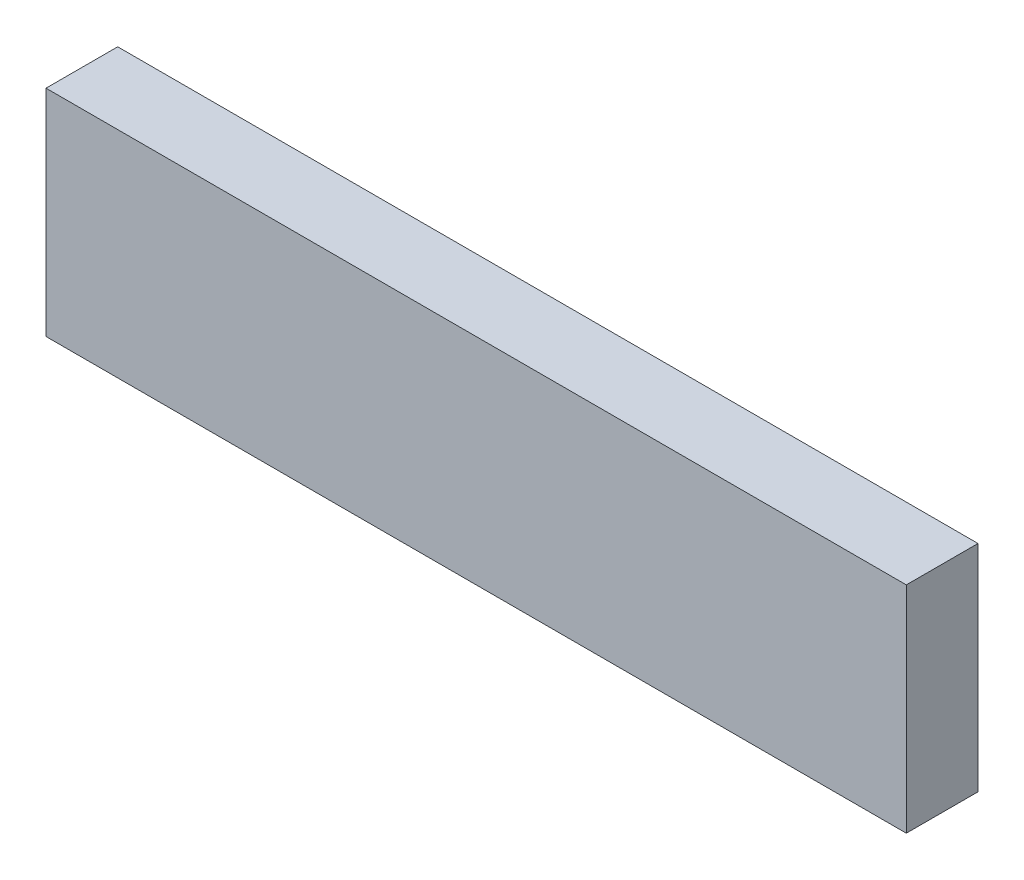
ISO-10303-21;
HEADER;
FILE_DESCRIPTION(('STEP AP214'),'2;1');
FILE_NAME('part.step','',(''),(''),'','','');
FILE_SCHEMA(('AUTOMOTIVE_DESIGN { 1 0 10303 214 1 1 1 1 }'));
ENDSEC;
DATA;
#1=APPLICATION_CONTEXT('core data for automotive mechanical design processes');
#2=APPLICATION_PROTOCOL_DEFINITION('international standard','automotive_design',2000,#1);
#3=PRODUCT_CONTEXT('',#1,'mechanical');
#4=PRODUCT('Part','Part','',(#3));
#5=PRODUCT_RELATED_PRODUCT_CATEGORY('part','',(#4));
#6=PRODUCT_DEFINITION_FORMATION('','',#4);
#7=PRODUCT_DEFINITION_CONTEXT('part definition',#1,'design');
#8=PRODUCT_DEFINITION('design','',#6,#7);
#9=PRODUCT_DEFINITION_SHAPE('','',#8);
#10=(LENGTH_UNIT() NAMED_UNIT(*) SI_UNIT(.MILLI.,.METRE.));
#11=(NAMED_UNIT(*) PLANE_ANGLE_UNIT() SI_UNIT($,.RADIAN.));
#12=(NAMED_UNIT(*) SI_UNIT($,.STERADIAN.) SOLID_ANGLE_UNIT());
#13=UNCERTAINTY_MEASURE_WITH_UNIT(LENGTH_MEASURE(1.E-05),#10,'distance_accuracy_value','');
#14=(GEOMETRIC_REPRESENTATION_CONTEXT(3) GLOBAL_UNCERTAINTY_ASSIGNED_CONTEXT((#13)) GLOBAL_UNIT_ASSIGNED_CONTEXT((#10,
#11,#12)) REPRESENTATION_CONTEXT('',''));
#15=CARTESIAN_POINT('',(0.,0.,0.));
#16=DIRECTION('',(0.,0.,1.));
#17=DIRECTION('',(1.,0.,0.));
#18=AXIS2_PLACEMENT_3D('',#15,#16,#17);
#19=CARTESIAN_POINT('',(-60.,-25.,480.));
#20=DIRECTION('',(0.,0.,1.));
#21=DIRECTION('',(1.,0.,0.));
#22=AXIS2_PLACEMENT_3D('',#19,#20,#21);
#23=PLANE('',#22);
#24=DIRECTION('',(0.,1.,0.));
#25=VECTOR('',#24,1.);
#26=CARTESIAN_POINT('',(-60.,-25.,480.));
#27=LINE('',#26,#25);
#28=CARTESIAN_POINT('',(-60.,-25.,480.));
#29=VERTEX_POINT('',#28);
#30=CARTESIAN_POINT('',(-60.,5.,480.));
#31=VERTEX_POINT('',#30);
#32=EDGE_CURVE('E88',#29,#31,#27,.T.);
#33=ORIENTED_EDGE('',*,*,#32,.F.);
#34=DIRECTION('',(1.,0.,0.));
#35=VECTOR('',#34,1.);
#36=CARTESIAN_POINT('',(-60.,-25.,480.));
#37=LINE('',#36,#35);
#38=CARTESIAN_POINT('',(60.,-25.,480.));
#39=VERTEX_POINT('',#38);
#40=EDGE_CURVE('E110',#29,#39,#37,.T.);
#41=ORIENTED_EDGE('',*,*,#40,.T.);
#42=DIRECTION('',(0.,1.,0.));
#43=VECTOR('',#42,1.);
#44=CARTESIAN_POINT('',(60.,-25.,480.));
#45=LINE('',#44,#43);
#46=CARTESIAN_POINT('',(60.,5.,480.));
#47=VERTEX_POINT('',#46);
#48=EDGE_CURVE('E105',#39,#47,#45,.T.);
#49=ORIENTED_EDGE('',*,*,#48,.T.);
#50=DIRECTION('',(1.,0.,0.));
#51=VECTOR('',#50,1.);
#52=CARTESIAN_POINT('',(-60.,5.,480.));
#53=LINE('',#52,#51);
#54=EDGE_CURVE('E9',#31,#47,#53,.T.);
#55=ORIENTED_EDGE('',*,*,#54,.F.);
#56=EDGE_LOOP('',(#33,#41,#49,#55));
#57=FACE_BOUND('',#56,.T.);
#58=ADVANCED_FACE('F15',(#57),#23,.T.);
#59=CARTESIAN_POINT('',(-60.,-25.,470.));
#60=DIRECTION('',(0.,0.,1.));
#61=DIRECTION('',(1.,0.,0.));
#62=AXIS2_PLACEMENT_3D('',#59,#60,#61);
#63=PLANE('',#62);
#64=DIRECTION('',(1.,0.,0.));
#65=VECTOR('',#64,1.);
#66=CARTESIAN_POINT('',(-60.,5.,470.));
#67=LINE('',#66,#65);
#68=CARTESIAN_POINT('',(-60.,5.,470.));
#69=VERTEX_POINT('',#68);
#70=CARTESIAN_POINT('',(60.,5.,470.));
#71=VERTEX_POINT('',#70);
#72=EDGE_CURVE('E18',#69,#71,#67,.T.);
#73=ORIENTED_EDGE('',*,*,#72,.T.);
#74=DIRECTION('',(0.,1.,0.));
#75=VECTOR('',#74,1.);
#76=CARTESIAN_POINT('',(60.,-25.,470.));
#77=LINE('',#76,#75);
#78=CARTESIAN_POINT('',(60.,-25.,470.));
#79=VERTEX_POINT('',#78);
#80=EDGE_CURVE('E97',#79,#71,#77,.T.);
#81=ORIENTED_EDGE('',*,*,#80,.F.);
#82=DIRECTION('',(1.,0.,0.));
#83=VECTOR('',#82,1.);
#84=CARTESIAN_POINT('',(-60.,-25.,470.));
#85=LINE('',#84,#83);
#86=CARTESIAN_POINT('',(-60.,-25.,470.));
#87=VERTEX_POINT('',#86);
#88=EDGE_CURVE('E72',#87,#79,#85,.T.);
#89=ORIENTED_EDGE('',*,*,#88,.F.);
#90=DIRECTION('',(0.,1.,0.));
#91=VECTOR('',#90,1.);
#92=CARTESIAN_POINT('',(-60.,-25.,470.));
#93=LINE('',#92,#91);
#94=EDGE_CURVE('E76',#87,#69,#93,.T.);
#95=ORIENTED_EDGE('',*,*,#94,.T.);
#96=EDGE_LOOP('',(#73,#81,#89,#95));
#97=FACE_BOUND('',#96,.T.);
#98=ADVANCED_FACE('F80',(#97),#63,.F.);
#99=CARTESIAN_POINT('',(-60.,5.,470.));
#100=DIRECTION('',(0.,1.,0.));
#101=DIRECTION('',(1.,0.,0.));
#102=AXIS2_PLACEMENT_3D('',#99,#100,#101);
#103=PLANE('',#102);
#104=ORIENTED_EDGE('',*,*,#72,.F.);
#105=DIRECTION('',(0.,0.,1.));
#106=VECTOR('',#105,1.);
#107=CARTESIAN_POINT('',(-60.,5.,470.));
#108=LINE('',#107,#106);
#109=EDGE_CURVE('E68',#69,#31,#108,.T.);
#110=ORIENTED_EDGE('',*,*,#109,.T.);
#111=ORIENTED_EDGE('',*,*,#54,.T.);
#112=DIRECTION('',(0.,0.,1.));
#113=VECTOR('',#112,1.);
#114=CARTESIAN_POINT('',(60.,5.,470.));
#115=LINE('',#114,#113);
#116=EDGE_CURVE('E75',#71,#47,#115,.T.);
#117=ORIENTED_EDGE('',*,*,#116,.F.);
#118=EDGE_LOOP('',(#104,#110,#111,#117));
#119=FACE_BOUND('',#118,.T.);
#120=ADVANCED_FACE('F66',(#119),#103,.T.);
#121=CARTESIAN_POINT('',(-60.,-25.,470.));
#122=DIRECTION('',(0.,1.,0.));
#123=DIRECTION('',(1.,0.,0.));
#124=AXIS2_PLACEMENT_3D('',#121,#122,#123);
#125=PLANE('',#124);
#126=DIRECTION('',(0.,0.,1.));
#127=VECTOR('',#126,1.);
#128=CARTESIAN_POINT('',(60.,-25.,470.));
#129=LINE('',#128,#127);
#130=EDGE_CURVE('E94',#79,#39,#129,.T.);
#131=ORIENTED_EDGE('',*,*,#130,.T.);
#132=ORIENTED_EDGE('',*,*,#40,.F.);
#133=DIRECTION('',(0.,0.,1.));
#134=VECTOR('',#133,1.);
#135=CARTESIAN_POINT('',(-60.,-25.,470.));
#136=LINE('',#135,#134);
#137=EDGE_CURVE('E85',#87,#29,#136,.T.);
#138=ORIENTED_EDGE('',*,*,#137,.F.);
#139=ORIENTED_EDGE('',*,*,#88,.T.);
#140=EDGE_LOOP('',(#131,#132,#138,#139));
#141=FACE_BOUND('',#140,.T.);
#142=ADVANCED_FACE('F117',(#141),#125,.F.);
#143=CARTESIAN_POINT('',(60.,-25.,470.));
#144=DIRECTION('',(1.,0.,0.));
#145=DIRECTION('',(0.,1.,0.));
#146=AXIS2_PLACEMENT_3D('',#143,#144,#145);
#147=PLANE('',#146);
#148=ORIENTED_EDGE('',*,*,#130,.F.);
#149=ORIENTED_EDGE('',*,*,#80,.T.);
#150=ORIENTED_EDGE('',*,*,#116,.T.);
#151=ORIENTED_EDGE('',*,*,#48,.F.);
#152=EDGE_LOOP('',(#148,#149,#150,#151));
#153=FACE_BOUND('',#152,.T.);
#154=ADVANCED_FACE('F116',(#153),#147,.T.);
#155=CARTESIAN_POINT('',(-60.,-25.,470.));
#156=DIRECTION('',(1.,0.,0.));
#157=DIRECTION('',(0.,1.,0.));
#158=AXIS2_PLACEMENT_3D('',#155,#156,#157);
#159=PLANE('',#158);
#160=ORIENTED_EDGE('',*,*,#32,.T.);
#161=ORIENTED_EDGE('',*,*,#109,.F.);
#162=ORIENTED_EDGE('',*,*,#94,.F.);
#163=ORIENTED_EDGE('',*,*,#137,.T.);
#164=EDGE_LOOP('',(#160,#161,#162,#163));
#165=FACE_BOUND('',#164,.T.);
#166=ADVANCED_FACE('F82',(#165),#159,.F.);
#167=CLOSED_SHELL('',(#58,#98,#120,#142,#154,#166));
#168=MANIFOLD_SOLID_BREP('B1',#167);
#169=ADVANCED_BREP_SHAPE_REPRESENTATION('',(#18,#168),#14);
#170=SHAPE_DEFINITION_REPRESENTATION(#9,#169);
ENDSEC;
END-ISO-10303-21;
